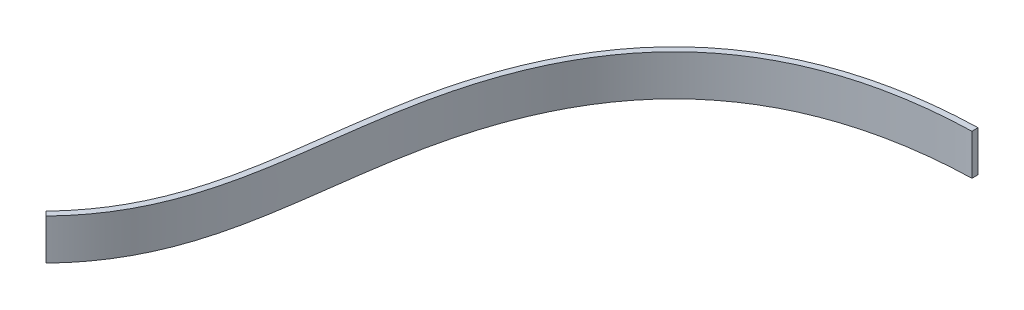
ISO-10303-21;
HEADER;
FILE_DESCRIPTION(('STEP AP214'),'2;1');
FILE_NAME('part.step','',(''),(''),'','','');
FILE_SCHEMA(('AUTOMOTIVE_DESIGN { 1 0 10303 214 1 1 1 1 }'));
ENDSEC;
DATA;
#1=APPLICATION_CONTEXT('core data for automotive mechanical design processes');
#2=APPLICATION_PROTOCOL_DEFINITION('international standard','automotive_design',2000,#1);
#3=PRODUCT_CONTEXT('',#1,'mechanical');
#4=PRODUCT('Part','Part','',(#3));
#5=PRODUCT_RELATED_PRODUCT_CATEGORY('part','',(#4));
#6=PRODUCT_DEFINITION_FORMATION('','',#4);
#7=PRODUCT_DEFINITION_CONTEXT('part definition',#1,'design');
#8=PRODUCT_DEFINITION('design','',#6,#7);
#9=PRODUCT_DEFINITION_SHAPE('','',#8);
#10=(LENGTH_UNIT() NAMED_UNIT(*) SI_UNIT(.MILLI.,.METRE.));
#11=(NAMED_UNIT(*) PLANE_ANGLE_UNIT() SI_UNIT($,.RADIAN.));
#12=(NAMED_UNIT(*) SI_UNIT($,.STERADIAN.) SOLID_ANGLE_UNIT());
#13=UNCERTAINTY_MEASURE_WITH_UNIT(LENGTH_MEASURE(1.E-05),#10,'distance_accuracy_value','');
#14=(GEOMETRIC_REPRESENTATION_CONTEXT(3) GLOBAL_UNCERTAINTY_ASSIGNED_CONTEXT((#13)) GLOBAL_UNIT_ASSIGNED_CONTEXT((#10,
#11,#12)) REPRESENTATION_CONTEXT('',''));
#15=CARTESIAN_POINT('',(0.,0.,0.));
#16=DIRECTION('',(0.,0.,1.));
#17=DIRECTION('',(1.,0.,0.));
#18=AXIS2_PLACEMENT_3D('',#15,#16,#17);
#19=CARTESIAN_POINT('',(143.581495405405,20.,-302.648451856139));
#20=CARTESIAN_POINT('',(42.6182518100593,20.,-299.981139349884));
#21=CARTESIAN_POINT('',(-24.1528760622217,20.,-186.95013809895));
#22=CARTESIAN_POINT('',(-11.2399087374139,20.,-78.0160911304326));
#23=CARTESIAN_POINT('',(-49.571302882974,20.,-38.6484518561353));
#24=B_SPLINE_CURVE_WITH_KNOTS('',3,(#19,#20,#21,#22,#23),.UNSPECIFIED.,.F.,.F.,(4,1,4),(0.,
0.513498925399934,1.),.UNSPECIFIED.);
#25=DIRECTION('',(0.,-1.,0.));
#26=VECTOR('',#25,1.);
#27=SURFACE_OF_LINEAR_EXTRUSION('',#24,#26);
#28=CARTESIAN_POINT('',(143.581495405405,0.,-302.648451856139));
#29=CARTESIAN_POINT('',(42.6182518100593,0.,-299.981139349884));
#30=CARTESIAN_POINT('',(-24.1528760622217,0.,-186.95013809895));
#31=CARTESIAN_POINT('',(-11.2399087374139,0.,-78.0160911304326));
#32=CARTESIAN_POINT('',(-49.571302882974,0.,-38.6484518561353));
#33=B_SPLINE_CURVE_WITH_KNOTS('',3,(#28,#29,#30,#31,#32),.UNSPECIFIED.,.F.,.F.,(4,1,4),(0.,
0.513498925399934,1.),.UNSPECIFIED.);
#34=CARTESIAN_POINT('',(143.581495405405,0.,-302.648451856139));
#35=VERTEX_POINT('',#34);
#36=CARTESIAN_POINT('',(-49.571302882974,0.,-38.6484518561353));
#37=VERTEX_POINT('',#36);
#38=EDGE_CURVE('E116',#35,#37,#33,.T.);
#39=ORIENTED_EDGE('',*,*,#38,.T.);
#40=DIRECTION('',(0.,-1.,0.));
#41=VECTOR('',#40,1.);
#42=CARTESIAN_POINT('',(-49.571302882974,20.,-38.6484518561353));
#43=LINE('',#42,#41);
#44=CARTESIAN_POINT('',(-49.571302882974,20.,-38.6484518561353));
#45=VERTEX_POINT('',#44);
#46=EDGE_CURVE('E11',#45,#37,#43,.T.);
#47=ORIENTED_EDGE('',*,*,#46,.F.);
#48=CARTESIAN_POINT('',(143.581495405405,20.,-302.648451856139));
#49=VERTEX_POINT('',#48);
#50=EDGE_CURVE('E85',#49,#45,#24,.T.);
#51=ORIENTED_EDGE('',*,*,#50,.F.);
#52=DIRECTION('',(0.,-1.,0.));
#53=VECTOR('',#52,1.);
#54=CARTESIAN_POINT('',(143.581495405405,20.,-302.648451856139));
#55=LINE('',#54,#53);
#56=EDGE_CURVE('E93',#49,#35,#55,.T.);
#57=ORIENTED_EDGE('',*,*,#56,.T.);
#58=EDGE_LOOP('',(#39,#47,#51,#57));
#59=FACE_BOUND('',#58,.T.);
#60=ADVANCED_FACE('F33',(#59),#27,.F.);
#61=CARTESIAN_POINT('',(-47.4218823701451,20.,-36.5556089430072));
#62=DIRECTION('',(0.697614304376026,0.,-0.716473504276294));
#63=DIRECTION('',(-0.716473504276294,0.,-0.697614304376026));
#64=AXIS2_PLACEMENT_3D('',#61,#62,#63);
#65=PLANE('',#64);
#66=DIRECTION('',(0.716473504276294,0.,0.697614304376026));
#67=VECTOR('',#66,1.);
#68=CARTESIAN_POINT('',(-47.4218823701451,0.,-36.5556089430072));
#69=LINE('',#68,#67);
#70=CARTESIAN_POINT('',(-47.4218823701451,0.,-36.5556089430072));
#71=VERTEX_POINT('',#70);
#72=EDGE_CURVE('E89',#37,#71,#69,.T.);
#73=ORIENTED_EDGE('',*,*,#72,.T.);
#74=DIRECTION('',(0.,-1.,0.));
#75=VECTOR('',#74,1.);
#76=CARTESIAN_POINT('',(-47.4218823701451,20.,-36.5556089430072));
#77=LINE('',#76,#75);
#78=CARTESIAN_POINT('',(-47.4218823701451,20.,-36.5556089430072));
#79=VERTEX_POINT('',#78);
#80=EDGE_CURVE('E42',#79,#71,#77,.T.);
#81=ORIENTED_EDGE('',*,*,#80,.F.);
#82=DIRECTION('',(0.716473504276294,0.,0.697614304376026));
#83=VECTOR('',#82,1.);
#84=CARTESIAN_POINT('',(-47.4218823701451,20.,-36.5556089430072));
#85=LINE('',#84,#83);
#86=EDGE_CURVE('E80',#45,#79,#85,.T.);
#87=ORIENTED_EDGE('',*,*,#86,.F.);
#88=ORIENTED_EDGE('',*,*,#46,.T.);
#89=EDGE_LOOP('',(#73,#81,#87,#88));
#90=FACE_BOUND('',#89,.T.);
#91=ADVANCED_FACE('F88',(#90),#65,.F.);
#92=CARTESIAN_POINT('',(-47.4218823701451,20.,-36.5556089430072));
#93=CARTESIAN_POINT('',(-46.1716260053423,20.,-37.8396645498302));
#94=CARTESIAN_POINT('',(-43.7137949575939,20.,-40.4899629478975));
#95=CARTESIAN_POINT('',(-40.3367415416056,20.,-44.5099983182512));
#96=CARTESIAN_POINT('',(-37.2059952367163,20.,-48.6239380671382));
#97=CARTESIAN_POINT('',(-33.3625939228855,20.,-54.2102554099633));
#98=CARTESIAN_POINT('',(-29.140195841174,20.,-61.3812309848421));
#99=CARTESIAN_POINT('',(-24.9069293713428,20.,-70.2525501164846));
#100=CARTESIAN_POINT('',(-21.4028619665318,20.,-79.3606462524182));
#101=CARTESIAN_POINT('',(-17.5623702697322,20.,-91.7842893844759));
#102=CARTESIAN_POINT('',(-14.0543732657649,20.,-107.777005807604));
#103=CARTESIAN_POINT('',(-11.0688705439182,20.,-127.541110755222));
#104=CARTESIAN_POINT('',(-8.48058958654378,20.,-147.725965065509));
#105=CARTESIAN_POINT('',(-5.48380336491977,20.,-168.174588864696));
#106=CARTESIAN_POINT('',(-1.27020471341993,20.,-188.749330599098));
#107=CARTESIAN_POINT('',(4.89713428017267,20.,-209.247707102074));
#108=CARTESIAN_POINT('',(13.4601709792295,20.,-229.024762139545));
#109=CARTESIAN_POINT('',(24.8892263785862,20.,-247.495790219578));
#110=CARTESIAN_POINT('',(39.6539792483459,20.,-264.089767785643));
#111=CARTESIAN_POINT('',(55.1590651444312,20.,-275.899545458193));
#112=CARTESIAN_POINT('',(69.7583743268411,20.,-283.856984497389));
#113=CARTESIAN_POINT('',(81.8764027172364,20.,-289.005808150813));
#114=CARTESIAN_POINT('',(95.2331196310541,20.,-293.259110656595));
#115=CARTESIAN_POINT('',(107.452737017518,20.,-295.99161925493));
#116=CARTESIAN_POINT('',(117.916080591754,20.,-297.650428944593));
#117=CARTESIAN_POINT('',(126.113013538029,20.,-298.620780731391));
#118=CARTESIAN_POINT('',(133.250141821174,20.,-299.193093905579));
#119=CARTESIAN_POINT('',(139.128494960549,20.,-299.503608320079));
#120=CARTESIAN_POINT('',(142.157027602246,20.,-299.609772606146));
#121=CARTESIAN_POINT('',(143.660723709079,20.,-299.649498225971));
#122=B_SPLINE_CURVE_WITH_KNOTS('',3,(#92,#93,#94,#95,#96,#97,#98,#99,#100,#101,#102,#103,#104,
#105,#106,#107,#108,#109,#110,#111,#112,#113,#114,#115,#116,#117,#118,#119,#120,#121),
.UNSPECIFIED.,.F.,.F.,(4,1,1,1,1,1,1,1,1,1,1,1,1,1,1,1,1,1,1,1,1,1,1,1,1,1,1,4),(0.,0.015625,
0.03125,0.046875,0.0625,0.09375,0.125,0.15625,0.1875,0.25,0.3125,0.375,0.4375,0.5,0.5625,0.625,
0.6875,0.75,0.8125,0.84375,0.875,0.90625,0.9375,0.953125,0.96875,0.984375,0.9921875,1.),.UNSPECIFIED.);
#123=DIRECTION('',(0.,-1.,0.));
#124=VECTOR('',#123,1.);
#125=SURFACE_OF_LINEAR_EXTRUSION('',#122,#124);
#126=CARTESIAN_POINT('',(-47.4218823701451,0.,-36.5556089430072));
#127=CARTESIAN_POINT('',(-46.1716260053423,0.,-37.8396645498302));
#128=CARTESIAN_POINT('',(-43.7137949575939,0.,-40.4899629478975));
#129=CARTESIAN_POINT('',(-40.3367415416056,0.,-44.5099983182512));
#130=CARTESIAN_POINT('',(-37.2059952367163,0.,-48.6239380671382));
#131=CARTESIAN_POINT('',(-33.3625939228855,0.,-54.2102554099633));
#132=CARTESIAN_POINT('',(-29.140195841174,0.,-61.3812309848421));
#133=CARTESIAN_POINT('',(-24.9069293713428,0.,-70.2525501164846));
#134=CARTESIAN_POINT('',(-21.4028619665318,0.,-79.3606462524182));
#135=CARTESIAN_POINT('',(-17.5623702697322,0.,-91.7842893844759));
#136=CARTESIAN_POINT('',(-14.0543732657649,0.,-107.777005807604));
#137=CARTESIAN_POINT('',(-11.0688705439182,0.,-127.541110755222));
#138=CARTESIAN_POINT('',(-8.48058958654378,0.,-147.725965065509));
#139=CARTESIAN_POINT('',(-5.48380336491977,0.,-168.174588864696));
#140=CARTESIAN_POINT('',(-1.27020471341993,0.,-188.749330599098));
#141=CARTESIAN_POINT('',(4.89713428017267,0.,-209.247707102074));
#142=CARTESIAN_POINT('',(13.4601709792295,0.,-229.024762139545));
#143=CARTESIAN_POINT('',(24.8892263785862,0.,-247.495790219578));
#144=CARTESIAN_POINT('',(39.6539792483459,0.,-264.089767785643));
#145=CARTESIAN_POINT('',(55.1590651444312,0.,-275.899545458193));
#146=CARTESIAN_POINT('',(69.7583743268411,0.,-283.856984497389));
#147=CARTESIAN_POINT('',(81.8764027172364,0.,-289.005808150813));
#148=CARTESIAN_POINT('',(95.2331196310541,0.,-293.259110656595));
#149=CARTESIAN_POINT('',(107.452737017518,0.,-295.99161925493));
#150=CARTESIAN_POINT('',(117.916080591754,0.,-297.650428944593));
#151=CARTESIAN_POINT('',(126.113013538029,0.,-298.620780731391));
#152=CARTESIAN_POINT('',(133.250141821174,0.,-299.193093905579));
#153=CARTESIAN_POINT('',(139.128494960549,0.,-299.503608320079));
#154=CARTESIAN_POINT('',(142.157027602246,0.,-299.609772606146));
#155=CARTESIAN_POINT('',(143.660723709079,0.,-299.649498225971));
#156=B_SPLINE_CURVE_WITH_KNOTS('',3,(#126,#127,#128,#129,#130,#131,#132,#133,#134,#135,#136,
#137,#138,#139,#140,#141,#142,#143,#144,#145,#146,#147,#148,#149,#150,#151,#152,#153,#154,#155),
.UNSPECIFIED.,.F.,.F.,(4,1,1,1,1,1,1,1,1,1,1,1,1,1,1,1,1,1,1,1,1,1,1,1,1,1,1,4),(0.,0.015625,
0.03125,0.046875,0.0625,0.09375,0.125,0.15625,0.1875,0.25,0.3125,0.375,0.4375,0.5,0.5625,0.625,
0.6875,0.75,0.8125,0.84375,0.875,0.90625,0.9375,0.953125,0.96875,0.984375,0.9921875,1.),.UNSPECIFIED.);
#157=CARTESIAN_POINT('',(143.660723709079,0.,-299.649498225971));
#158=VERTEX_POINT('',#157);
#159=EDGE_CURVE('E67',#71,#158,#156,.T.);
#160=ORIENTED_EDGE('',*,*,#159,.T.);
#161=DIRECTION('',(0.,-1.,0.));
#162=VECTOR('',#161,1.);
#163=CARTESIAN_POINT('',(143.660723709079,20.,-299.649498225971));
#164=LINE('',#163,#162);
#165=CARTESIAN_POINT('',(143.660723709079,20.,-299.649498225971));
#166=VERTEX_POINT('',#165);
#167=EDGE_CURVE('E90',#166,#158,#164,.T.);
#168=ORIENTED_EDGE('',*,*,#167,.F.);
#169=EDGE_CURVE('E83',#79,#166,#122,.T.);
#170=ORIENTED_EDGE('',*,*,#169,.F.);
#171=ORIENTED_EDGE('',*,*,#80,.T.);
#172=EDGE_LOOP('',(#160,#168,#170,#171));
#173=FACE_BOUND('',#172,.T.);
#174=ADVANCED_FACE('F91',(#173),#125,.F.);
#175=CARTESIAN_POINT('',(143.660723709079,20.,-299.649498225971));
#176=DIRECTION('',(-0.999651210055956,0.,0.0264094345578112));
#177=DIRECTION('',(0.0264094345578112,0.,0.999651210055956));
#178=AXIS2_PLACEMENT_3D('',#175,#176,#177);
#179=PLANE('',#178);
#180=DIRECTION('',(-0.0264094345578112,0.,-0.999651210055956));
#181=VECTOR('',#180,1.);
#182=CARTESIAN_POINT('',(143.660723709079,0.,-299.649498225971));
#183=LINE('',#182,#181);
#184=EDGE_CURVE('E73',#158,#35,#183,.T.);
#185=ORIENTED_EDGE('',*,*,#184,.T.);
#186=ORIENTED_EDGE('',*,*,#56,.F.);
#187=DIRECTION('',(-0.0264094345578112,0.,-0.999651210055956));
#188=VECTOR('',#187,1.);
#189=CARTESIAN_POINT('',(143.660723709079,20.,-299.649498225971));
#190=LINE('',#189,#188);
#191=EDGE_CURVE('E50',#166,#49,#190,.T.);
#192=ORIENTED_EDGE('',*,*,#191,.F.);
#193=ORIENTED_EDGE('',*,*,#167,.T.);
#194=EDGE_LOOP('',(#185,#186,#192,#193));
#195=FACE_BOUND('',#194,.T.);
#196=ADVANCED_FACE('F105',(#195),#179,.F.);
#197=CARTESIAN_POINT('',(-3.85298891213988,20.,-189.472242439467));
#198=DIRECTION('',(0.,-1.,0.));
#199=DIRECTION('',(0.,0.,-1.));
#200=AXIS2_PLACEMENT_3D('',#197,#198,#199);
#201=PLANE('',#200);
#202=ORIENTED_EDGE('',*,*,#50,.T.);
#203=ORIENTED_EDGE('',*,*,#86,.T.);
#204=ORIENTED_EDGE('',*,*,#169,.T.);
#205=ORIENTED_EDGE('',*,*,#191,.T.);
#206=EDGE_LOOP('',(#202,#203,#204,#205));
#207=FACE_BOUND('',#206,.T.);
#208=ADVANCED_FACE('F81',(#207),#201,.F.);
#209=CARTESIAN_POINT('',(-3.85298891213988,0.,-189.472242439467));
#210=DIRECTION('',(0.,-1.,0.));
#211=DIRECTION('',(0.,0.,-1.));
#212=AXIS2_PLACEMENT_3D('',#209,#210,#211);
#213=PLANE('',#212);
#214=ORIENTED_EDGE('',*,*,#38,.F.);
#215=ORIENTED_EDGE('',*,*,#184,.F.);
#216=ORIENTED_EDGE('',*,*,#159,.F.);
#217=ORIENTED_EDGE('',*,*,#72,.F.);
#218=EDGE_LOOP('',(#214,#215,#216,#217));
#219=FACE_BOUND('',#218,.T.);
#220=ADVANCED_FACE('F133',(#219),#213,.T.);
#221=CLOSED_SHELL('',(#60,#91,#174,#196,#208,#220));
#222=MANIFOLD_SOLID_BREP('B2',#221);
#223=ADVANCED_BREP_SHAPE_REPRESENTATION('',(#18,#222),#14);
#224=SHAPE_DEFINITION_REPRESENTATION(#9,#223);
ENDSEC;
END-ISO-10303-21;
